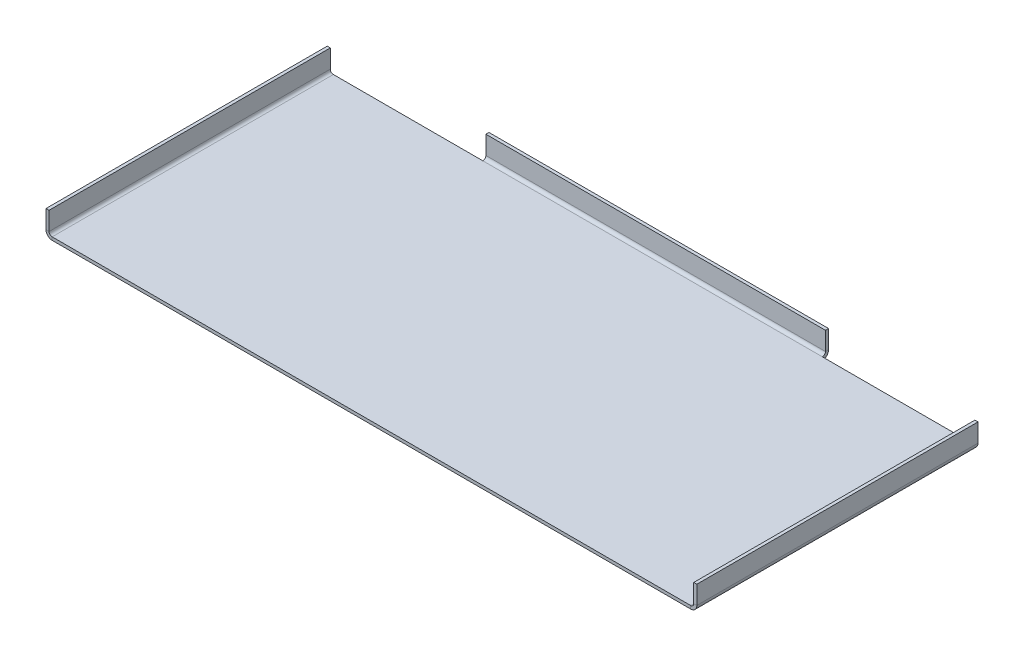
ISO-10303-21;
HEADER;
FILE_DESCRIPTION(('STEP AP214'),'2;1');
FILE_NAME('part.step','',(''),(''),'','','');
FILE_SCHEMA(('AUTOMOTIVE_DESIGN { 1 0 10303 214 1 1 1 1 }'));
ENDSEC;
DATA;
#1=APPLICATION_CONTEXT('core data for automotive mechanical design processes');
#2=APPLICATION_PROTOCOL_DEFINITION('international standard','automotive_design',2000,#1);
#3=PRODUCT_CONTEXT('',#1,'mechanical');
#4=PRODUCT('Part','Part','',(#3));
#5=PRODUCT_RELATED_PRODUCT_CATEGORY('part','',(#4));
#6=PRODUCT_DEFINITION_FORMATION('','',#4);
#7=PRODUCT_DEFINITION_CONTEXT('part definition',#1,'design');
#8=PRODUCT_DEFINITION('design','',#6,#7);
#9=PRODUCT_DEFINITION_SHAPE('','',#8);
#10=(LENGTH_UNIT() NAMED_UNIT(*) SI_UNIT(.MILLI.,.METRE.));
#11=(NAMED_UNIT(*) PLANE_ANGLE_UNIT() SI_UNIT($,.RADIAN.));
#12=(NAMED_UNIT(*) SI_UNIT($,.STERADIAN.) SOLID_ANGLE_UNIT());
#13=UNCERTAINTY_MEASURE_WITH_UNIT(LENGTH_MEASURE(1.E-05),#10,'distance_accuracy_value','');
#14=(GEOMETRIC_REPRESENTATION_CONTEXT(3) GLOBAL_UNCERTAINTY_ASSIGNED_CONTEXT((#13)) GLOBAL_UNIT_ASSIGNED_CONTEXT((#10,
#11,#12)) REPRESENTATION_CONTEXT('',''));
#15=CARTESIAN_POINT('',(0.,0.,0.));
#16=DIRECTION('',(0.,0.,1.));
#17=DIRECTION('',(1.,0.,0.));
#18=AXIS2_PLACEMENT_3D('',#15,#16,#17);
#19=CARTESIAN_POINT('',(0.,-3.175,0.));
#20=DIRECTION('',(0.,-1.,0.));
#21=DIRECTION('',(0.,0.,-1.));
#22=AXIS2_PLACEMENT_3D('',#19,#20,#21);
#23=PLANE('',#22);
#24=DIRECTION('',(1.,0.,0.));
#25=VECTOR('',#24,1.);
#26=CARTESIAN_POINT('',(0.,-3.175,0.));
#27=LINE('',#26,#25);
#28=CARTESIAN_POINT('',(6.34999999999997,-3.17499999999998,0.));
#29=VERTEX_POINT('',#28);
#30=CARTESIAN_POINT('',(666.76016,-3.175,0.));
#31=VERTEX_POINT('',#30);
#32=EDGE_CURVE('E390',#29,#31,#27,.T.);
#33=ORIENTED_EDGE('',*,*,#32,.F.);
#34=DIRECTION('',(0.,0.,1.));
#35=VECTOR('',#34,1.);
#36=CARTESIAN_POINT('',(6.34999999999997,-3.17499999999998,0.));
#37=LINE('',#36,#35);
#38=CARTESIAN_POINT('',(6.34999999999995,-3.175,-290.83));
#39=VERTEX_POINT('',#38);
#40=EDGE_CURVE('E230',#29,#39,#37,.F.);
#41=ORIENTED_EDGE('',*,*,#40,.T.);
#42=DIRECTION('',(-1.,0.,0.));
#43=VECTOR('',#42,1.);
#44=CARTESIAN_POINT('',(0.,-3.175,-290.83));
#45=LINE('',#44,#43);
#46=CARTESIAN_POINT('',(160.930679916,-3.175,-290.83));
#47=VERTEX_POINT('',#46);
#48=EDGE_CURVE('E107',#47,#39,#45,.T.);
#49=ORIENTED_EDGE('',*,*,#48,.F.);
#50=DIRECTION('',(-1.,0.,0.));
#51=VECTOR('',#50,1.);
#52=CARTESIAN_POINT('',(160.930679916,-3.17500000000002,-290.83));
#53=LINE('',#52,#51);
#54=CARTESIAN_POINT('',(512.179480084,-3.17500000000002,-290.83));
#55=VERTEX_POINT('',#54);
#56=EDGE_CURVE('E368',#47,#55,#53,.F.);
#57=ORIENTED_EDGE('',*,*,#56,.T.);
#58=CARTESIAN_POINT('',(666.76016,-3.17499999999998,-290.83));
#59=VERTEX_POINT('',#58);
#60=EDGE_CURVE('E13',#59,#55,#45,.T.);
#61=ORIENTED_EDGE('',*,*,#60,.F.);
#62=DIRECTION('',(0.,0.,-1.));
#63=VECTOR('',#62,1.);
#64=CARTESIAN_POINT('',(666.76016,-3.17499999999998,-290.83));
#65=LINE('',#64,#63);
#66=EDGE_CURVE('E318',#59,#31,#65,.F.);
#67=ORIENTED_EDGE('',*,*,#66,.T.);
#68=EDGE_LOOP('',(#33,#41,#49,#57,#61,#67));
#69=FACE_BOUND('',#68,.T.);
#70=ADVANCED_FACE('F98',(#69),#23,.T.);
#71=CARTESIAN_POINT('',(0.,0.,0.));
#72=DIRECTION('',(0.,-1.,0.));
#73=DIRECTION('',(0.,0.,-1.));
#74=AXIS2_PLACEMENT_3D('',#71,#72,#73);
#75=PLANE('',#74);
#76=DIRECTION('',(0.,0.,1.));
#77=VECTOR('',#76,1.);
#78=CARTESIAN_POINT('',(6.34999999999999,0.,0.));
#79=LINE('',#78,#77);
#80=CARTESIAN_POINT('',(6.34999999999999,0.,0.));
#81=VERTEX_POINT('',#80);
#82=CARTESIAN_POINT('',(6.34999999999995,0.,-290.83));
#83=VERTEX_POINT('',#82);
#84=EDGE_CURVE('E280',#81,#83,#79,.F.);
#85=ORIENTED_EDGE('',*,*,#84,.F.);
#86=DIRECTION('',(1.,0.,0.));
#87=VECTOR('',#86,1.);
#88=CARTESIAN_POINT('',(0.,0.,0.));
#89=LINE('',#88,#87);
#90=CARTESIAN_POINT('',(666.76016,0.,0.));
#91=VERTEX_POINT('',#90);
#92=EDGE_CURVE('E387',#81,#91,#89,.T.);
#93=ORIENTED_EDGE('',*,*,#92,.T.);
#94=DIRECTION('',(0.,0.,-1.));
#95=VECTOR('',#94,1.);
#96=CARTESIAN_POINT('',(666.76016,0.,-290.83));
#97=LINE('',#96,#95);
#98=CARTESIAN_POINT('',(666.76016,0.,-290.83));
#99=VERTEX_POINT('',#98);
#100=EDGE_CURVE('E329',#99,#91,#97,.F.);
#101=ORIENTED_EDGE('',*,*,#100,.F.);
#102=DIRECTION('',(-1.,0.,0.));
#103=VECTOR('',#102,1.);
#104=CARTESIAN_POINT('',(0.,0.,-290.83));
#105=LINE('',#104,#103);
#106=CARTESIAN_POINT('',(512.179480084,0.,-290.83));
#107=VERTEX_POINT('',#106);
#108=EDGE_CURVE('E102',#99,#107,#105,.T.);
#109=ORIENTED_EDGE('',*,*,#108,.T.);
#110=DIRECTION('',(-1.,0.,0.));
#111=VECTOR('',#110,1.);
#112=CARTESIAN_POINT('',(160.930679916,0.,-290.83));
#113=LINE('',#112,#111);
#114=CARTESIAN_POINT('',(160.930679916,0.,-290.83));
#115=VERTEX_POINT('',#114);
#116=EDGE_CURVE('E379',#115,#107,#113,.F.);
#117=ORIENTED_EDGE('',*,*,#116,.F.);
#118=EDGE_CURVE('E393',#115,#83,#105,.T.);
#119=ORIENTED_EDGE('',*,*,#118,.T.);
#120=EDGE_LOOP('',(#85,#93,#101,#109,#117,#119));
#121=FACE_BOUND('',#120,.T.);
#122=ADVANCED_FACE('F403',(#121),#75,.F.);
#123=CARTESIAN_POINT('',(0.,-3.175,0.));
#124=DIRECTION('',(0.,0.,1.));
#125=DIRECTION('',(1.,0.,0.));
#126=AXIS2_PLACEMENT_3D('',#123,#124,#125);
#127=PLANE('',#126);
#128=ORIENTED_EDGE('',*,*,#92,.F.);
#129=DIRECTION('',(0.,-1.,0.));
#130=VECTOR('',#129,1.);
#131=CARTESIAN_POINT('',(6.34999999999999,0.,0.));
#132=LINE('',#131,#130);
#133=EDGE_CURVE('E276',#81,#29,#132,.T.);
#134=ORIENTED_EDGE('',*,*,#133,.T.);
#135=ORIENTED_EDGE('',*,*,#32,.T.);
#136=DIRECTION('',(0.,-1.,0.));
#137=VECTOR('',#136,1.);
#138=CARTESIAN_POINT('',(666.76016,0.,0.));
#139=LINE('',#138,#137);
#140=EDGE_CURVE('E333',#91,#31,#139,.T.);
#141=ORIENTED_EDGE('',*,*,#140,.F.);
#142=EDGE_LOOP('',(#128,#134,#135,#141));
#143=FACE_BOUND('',#142,.T.);
#144=ADVANCED_FACE('F100',(#143),#127,.T.);
#145=CARTESIAN_POINT('',(0.,-3.175,-290.83));
#146=DIRECTION('',(0.,0.,-1.));
#147=DIRECTION('',(-1.,0.,0.));
#148=AXIS2_PLACEMENT_3D('',#145,#146,#147);
#149=PLANE('',#148);
#150=ORIENTED_EDGE('',*,*,#108,.F.);
#151=DIRECTION('',(0.,-1.,0.));
#152=VECTOR('',#151,1.);
#153=CARTESIAN_POINT('',(666.76016,0.,-290.83));
#154=LINE('',#153,#152);
#155=EDGE_CURVE('E323',#99,#59,#154,.T.);
#156=ORIENTED_EDGE('',*,*,#155,.T.);
#157=ORIENTED_EDGE('',*,*,#60,.T.);
#158=DIRECTION('',(0.,-1.,0.));
#159=VECTOR('',#158,1.);
#160=CARTESIAN_POINT('',(512.179480084,0.,-290.83));
#161=LINE('',#160,#159);
#162=EDGE_CURVE('E384',#107,#55,#161,.T.);
#163=ORIENTED_EDGE('',*,*,#162,.F.);
#164=EDGE_LOOP('',(#150,#156,#157,#163));
#165=FACE_BOUND('',#164,.T.);
#166=ADVANCED_FACE('F414',(#165),#149,.T.);
#167=DIRECTION('',(0.,-1.,0.));
#168=VECTOR('',#167,1.);
#169=CARTESIAN_POINT('',(6.34999999999995,0.,-290.83));
#170=LINE('',#169,#168);
#171=EDGE_CURVE('E283',#83,#39,#170,.T.);
#172=ORIENTED_EDGE('',*,*,#171,.F.);
#173=ORIENTED_EDGE('',*,*,#118,.F.);
#174=DIRECTION('',(0.,-1.,0.));
#175=VECTOR('',#174,1.);
#176=CARTESIAN_POINT('',(160.930679916,0.,-290.83));
#177=LINE('',#176,#175);
#178=EDGE_CURVE('E374',#115,#47,#177,.T.);
#179=ORIENTED_EDGE('',*,*,#178,.T.);
#180=ORIENTED_EDGE('',*,*,#48,.T.);
#181=EDGE_LOOP('',(#172,#173,#179,#180));
#182=FACE_BOUND('',#181,.T.);
#183=ADVANCED_FACE('F424',(#182),#149,.T.);
#184=CARTESIAN_POINT('',(512.179480084,3.17499999999996,-290.83));
#185=DIRECTION('',(1.,0.,0.));
#186=DIRECTION('',(0.,0.,-1.));
#187=AXIS2_PLACEMENT_3D('',#184,#185,#186);
#188=PLANE('',#187);
#189=DIRECTION('',(0.,0.,1.));
#190=VECTOR('',#189,1.);
#191=CARTESIAN_POINT('',(512.179480084,3.175,-297.18));
#192=LINE('',#191,#190);
#193=CARTESIAN_POINT('',(512.179480084,3.17499999999995,-294.005));
#194=VERTEX_POINT('',#193);
#195=CARTESIAN_POINT('',(512.179480084,3.17499999999995,-297.18));
#196=VERTEX_POINT('',#195);
#197=EDGE_CURVE('E335',#194,#196,#192,.F.);
#198=ORIENTED_EDGE('',*,*,#197,.F.);
#199=CARTESIAN_POINT('',(512.179480084,3.17499999999996,-290.83));
#200=DIRECTION('',(-1.,0.,0.));
#201=DIRECTION('',(0.,0.,1.));
#202=AXIS2_PLACEMENT_3D('',#199,#200,#201);
#203=CIRCLE('',#202,3.17499999999998);
#204=EDGE_CURVE('E376',#107,#194,#203,.F.);
#205=ORIENTED_EDGE('',*,*,#204,.F.);
#206=ORIENTED_EDGE('',*,*,#162,.T.);
#207=CARTESIAN_POINT('',(512.179480084,3.17499999999996,-290.83));
#208=DIRECTION('',(-1.,0.,0.));
#209=DIRECTION('',(0.,0.,1.));
#210=AXIS2_PLACEMENT_3D('',#207,#208,#209);
#211=CIRCLE('',#210,6.34999999999998);
#212=EDGE_CURVE('E371',#55,#196,#211,.F.);
#213=ORIENTED_EDGE('',*,*,#212,.T.);
#214=EDGE_LOOP('',(#198,#205,#206,#213));
#215=FACE_BOUND('',#214,.T.);
#216=ADVANCED_FACE('F412',(#215),#188,.T.);
#217=CARTESIAN_POINT('',(160.930679916,3.17499999999996,-290.83));
#218=DIRECTION('',(1.,0.,0.));
#219=DIRECTION('',(0.,0.,-1.));
#220=AXIS2_PLACEMENT_3D('',#217,#218,#219);
#221=PLANE('',#220);
#222=CARTESIAN_POINT('',(160.930679916,3.17499999999996,-290.83));
#223=DIRECTION('',(-1.,0.,0.));
#224=DIRECTION('',(0.,0.,1.));
#225=AXIS2_PLACEMENT_3D('',#222,#223,#224);
#226=CIRCLE('',#225,3.17499999999998);
#227=CARTESIAN_POINT('',(160.930679916,3.17499999999995,-294.005));
#228=VERTEX_POINT('',#227);
#229=EDGE_CURVE('E341',#228,#115,#226,.T.);
#230=ORIENTED_EDGE('',*,*,#229,.F.);
#231=DIRECTION('',(0.,0.,1.));
#232=VECTOR('',#231,1.);
#233=CARTESIAN_POINT('',(160.930679916,3.17499999999998,-294.005));
#234=LINE('',#233,#232);
#235=CARTESIAN_POINT('',(160.930679916,3.17500000000001,-297.18));
#236=VERTEX_POINT('',#235);
#237=EDGE_CURVE('E362',#228,#236,#234,.F.);
#238=ORIENTED_EDGE('',*,*,#237,.T.);
#239=CARTESIAN_POINT('',(160.930679916,3.17499999999996,-290.83));
#240=DIRECTION('',(-1.,0.,0.));
#241=DIRECTION('',(0.,0.,1.));
#242=AXIS2_PLACEMENT_3D('',#239,#240,#241);
#243=CIRCLE('',#242,6.34999999999998);
#244=EDGE_CURVE('E123',#236,#47,#243,.T.);
#245=ORIENTED_EDGE('',*,*,#244,.T.);
#246=ORIENTED_EDGE('',*,*,#178,.F.);
#247=EDGE_LOOP('',(#230,#238,#245,#246));
#248=FACE_BOUND('',#247,.T.);
#249=ADVANCED_FACE('F425',(#248),#221,.F.);
#250=CARTESIAN_POINT('',(160.930679916,3.17499999999996,-290.83));
#251=DIRECTION('',(-1.,0.,0.));
#252=DIRECTION('',(0.,0.,-1.));
#253=AXIS2_PLACEMENT_3D('',#250,#251,#252);
#254=CYLINDRICAL_SURFACE('',#253,6.34999999999998);
#255=ORIENTED_EDGE('',*,*,#56,.F.);
#256=ORIENTED_EDGE('',*,*,#244,.F.);
#257=DIRECTION('',(-1.,0.,0.));
#258=VECTOR('',#257,1.);
#259=CARTESIAN_POINT('',(0.,3.17500000000001,-297.18));
#260=LINE('',#259,#258);
#261=EDGE_CURVE('E359',#196,#236,#260,.T.);
#262=ORIENTED_EDGE('',*,*,#261,.F.);
#263=ORIENTED_EDGE('',*,*,#212,.F.);
#264=EDGE_LOOP('',(#255,#256,#262,#263));
#265=FACE_BOUND('',#264,.T.);
#266=ADVANCED_FACE('F421',(#265),#254,.T.);
#267=CARTESIAN_POINT('',(160.930679916,3.17499999999996,-290.83));
#268=DIRECTION('',(-1.,0.,0.));
#269=DIRECTION('',(0.,0.,-1.));
#270=AXIS2_PLACEMENT_3D('',#267,#268,#269);
#271=CYLINDRICAL_SURFACE('',#270,3.17499999999998);
#272=ORIENTED_EDGE('',*,*,#116,.T.);
#273=ORIENTED_EDGE('',*,*,#204,.T.);
#274=DIRECTION('',(1.,0.,0.));
#275=VECTOR('',#274,1.);
#276=CARTESIAN_POINT('',(512.179480084,3.17499999999998,-294.005));
#277=LINE('',#276,#275);
#278=EDGE_CURVE('E364',#194,#228,#277,.F.);
#279=ORIENTED_EDGE('',*,*,#278,.T.);
#280=ORIENTED_EDGE('',*,*,#229,.T.);
#281=EDGE_LOOP('',(#272,#273,#279,#280));
#282=FACE_BOUND('',#281,.T.);
#283=ADVANCED_FACE('F408',(#282),#271,.F.);
#284=CARTESIAN_POINT('',(512.179480084,22.225,-297.18));
#285=DIRECTION('',(-1.,0.,0.));
#286=DIRECTION('',(0.,0.,1.));
#287=AXIS2_PLACEMENT_3D('',#284,#285,#286);
#288=PLANE('',#287);
#289=ORIENTED_EDGE('',*,*,#197,.T.);
#290=DIRECTION('',(0.,1.,0.));
#291=VECTOR('',#290,1.);
#292=CARTESIAN_POINT('',(512.179480084,-7.37488517934144E-13,-297.18));
#293=LINE('',#292,#291);
#294=CARTESIAN_POINT('',(512.179480084,22.225,-297.18));
#295=VERTEX_POINT('',#294);
#296=EDGE_CURVE('E349',#295,#196,#293,.F.);
#297=ORIENTED_EDGE('',*,*,#296,.F.);
#298=DIRECTION('',(0.,0.,1.));
#299=VECTOR('',#298,1.);
#300=CARTESIAN_POINT('',(512.179480084,22.225,-297.18));
#301=LINE('',#300,#299);
#302=CARTESIAN_POINT('',(512.179480084,22.225,-294.005));
#303=VERTEX_POINT('',#302);
#304=EDGE_CURVE('E342',#295,#303,#301,.T.);
#305=ORIENTED_EDGE('',*,*,#304,.T.);
#306=DIRECTION('',(0.,-1.,0.));
#307=VECTOR('',#306,1.);
#308=CARTESIAN_POINT('',(512.179480084,22.225,-294.005));
#309=LINE('',#308,#307);
#310=EDGE_CURVE('E356',#303,#194,#309,.T.);
#311=ORIENTED_EDGE('',*,*,#310,.T.);
#312=EDGE_LOOP('',(#289,#297,#305,#311));
#313=FACE_BOUND('',#312,.T.);
#314=ADVANCED_FACE('F442',(#313),#288,.F.);
#315=CARTESIAN_POINT('',(160.930679916,22.225,-297.18));
#316=DIRECTION('',(1.,0.,0.));
#317=DIRECTION('',(0.,0.,-1.));
#318=AXIS2_PLACEMENT_3D('',#315,#316,#317);
#319=PLANE('',#318);
#320=ORIENTED_EDGE('',*,*,#237,.F.);
#321=DIRECTION('',(0.,1.,0.));
#322=VECTOR('',#321,1.);
#323=CARTESIAN_POINT('',(160.930679916,22.225,-294.005));
#324=LINE('',#323,#322);
#325=CARTESIAN_POINT('',(160.930679916,22.225,-294.005));
#326=VERTEX_POINT('',#325);
#327=EDGE_CURVE('E354',#228,#326,#324,.T.);
#328=ORIENTED_EDGE('',*,*,#327,.T.);
#329=DIRECTION('',(0.,0.,1.));
#330=VECTOR('',#329,1.);
#331=CARTESIAN_POINT('',(160.930679916,22.225,-297.18));
#332=LINE('',#331,#330);
#333=CARTESIAN_POINT('',(160.930679916,22.225,-297.18));
#334=VERTEX_POINT('',#333);
#335=EDGE_CURVE('E338',#334,#326,#332,.T.);
#336=ORIENTED_EDGE('',*,*,#335,.F.);
#337=DIRECTION('',(0.,-1.,0.));
#338=VECTOR('',#337,1.);
#339=CARTESIAN_POINT('',(160.930679916,-7.37488517934144E-13,-297.18));
#340=LINE('',#339,#338);
#341=EDGE_CURVE('E347',#236,#334,#340,.F.);
#342=ORIENTED_EDGE('',*,*,#341,.F.);
#343=EDGE_LOOP('',(#320,#328,#336,#342));
#344=FACE_BOUND('',#343,.T.);
#345=ADVANCED_FACE('F435',(#344),#319,.F.);
#346=CARTESIAN_POINT('',(0.,-7.37488517934144E-13,-297.18));
#347=DIRECTION('',(0.,0.,-1.));
#348=DIRECTION('',(0.,1.,0.));
#349=AXIS2_PLACEMENT_3D('',#346,#347,#348);
#350=PLANE('',#349);
#351=ORIENTED_EDGE('',*,*,#296,.T.);
#352=ORIENTED_EDGE('',*,*,#261,.T.);
#353=ORIENTED_EDGE('',*,*,#341,.T.);
#354=DIRECTION('',(-1.,0.,0.));
#355=VECTOR('',#354,1.);
#356=CARTESIAN_POINT('',(0.,22.225,-297.18));
#357=LINE('',#356,#355);
#358=EDGE_CURVE('E345',#334,#295,#357,.F.);
#359=ORIENTED_EDGE('',*,*,#358,.T.);
#360=EDGE_LOOP('',(#351,#352,#353,#359));
#361=FACE_BOUND('',#360,.T.);
#362=ADVANCED_FACE('F438',(#361),#350,.T.);
#363=CARTESIAN_POINT('',(0.,-7.26403064683317E-13,-294.005));
#364=DIRECTION('',(0.,0.,-1.));
#365=DIRECTION('',(0.,1.,0.));
#366=AXIS2_PLACEMENT_3D('',#363,#364,#365);
#367=PLANE('',#366);
#368=ORIENTED_EDGE('',*,*,#278,.F.);
#369=ORIENTED_EDGE('',*,*,#310,.F.);
#370=DIRECTION('',(1.,0.,0.));
#371=VECTOR('',#370,1.);
#372=CARTESIAN_POINT('',(512.179480084,22.225,-294.005));
#373=LINE('',#372,#371);
#374=EDGE_CURVE('E352',#326,#303,#373,.T.);
#375=ORIENTED_EDGE('',*,*,#374,.F.);
#376=ORIENTED_EDGE('',*,*,#327,.F.);
#377=EDGE_LOOP('',(#368,#369,#375,#376));
#378=FACE_BOUND('',#377,.T.);
#379=ADVANCED_FACE('F430',(#378),#367,.F.);
#380=CARTESIAN_POINT('',(512.179480084,22.225,-297.18));
#381=DIRECTION('',(0.,-1.,0.));
#382=DIRECTION('',(0.,0.,-1.));
#383=AXIS2_PLACEMENT_3D('',#380,#381,#382);
#384=PLANE('',#383);
#385=ORIENTED_EDGE('',*,*,#374,.T.);
#386=ORIENTED_EDGE('',*,*,#304,.F.);
#387=ORIENTED_EDGE('',*,*,#358,.F.);
#388=ORIENTED_EDGE('',*,*,#335,.T.);
#389=EDGE_LOOP('',(#385,#386,#387,#388));
#390=FACE_BOUND('',#389,.T.);
#391=ADVANCED_FACE('F444',(#390),#384,.F.);
#392=CARTESIAN_POINT('',(666.76016,3.17500000000005,0.));
#393=DIRECTION('',(0.,0.,1.));
#394=DIRECTION('',(1.,0.,0.));
#395=AXIS2_PLACEMENT_3D('',#392,#393,#394);
#396=PLANE('',#395);
#397=DIRECTION('',(-1.,0.,0.));
#398=VECTOR('',#397,1.);
#399=CARTESIAN_POINT('',(673.11016,3.17500000000002,0.));
#400=LINE('',#399,#398);
#401=CARTESIAN_POINT('',(669.93516,3.17500000000004,0.));
#402=VERTEX_POINT('',#401);
#403=CARTESIAN_POINT('',(673.11016,3.17500000000002,0.));
#404=VERTEX_POINT('',#403);
#405=EDGE_CURVE('E286',#402,#404,#400,.F.);
#406=ORIENTED_EDGE('',*,*,#405,.F.);
#407=CARTESIAN_POINT('',(666.76016,3.17500000000005,0.));
#408=DIRECTION('',(0.,0.,-1.));
#409=DIRECTION('',(-1.,0.,0.));
#410=AXIS2_PLACEMENT_3D('',#407,#408,#409);
#411=CIRCLE('',#410,3.17500000000004);
#412=EDGE_CURVE('E326',#91,#402,#411,.F.);
#413=ORIENTED_EDGE('',*,*,#412,.F.);
#414=ORIENTED_EDGE('',*,*,#140,.T.);
#415=CARTESIAN_POINT('',(666.76016,3.17500000000005,0.));
#416=DIRECTION('',(0.,0.,-1.));
#417=DIRECTION('',(-1.,0.,0.));
#418=AXIS2_PLACEMENT_3D('',#415,#416,#417);
#419=CIRCLE('',#418,6.35000000000004);
#420=EDGE_CURVE('E115',#31,#404,#419,.F.);
#421=ORIENTED_EDGE('',*,*,#420,.T.);
#422=EDGE_LOOP('',(#406,#413,#414,#421));
#423=FACE_BOUND('',#422,.T.);
#424=ADVANCED_FACE('F446',(#423),#396,.T.);
#425=CARTESIAN_POINT('',(666.76016,3.17500000000005,-290.83));
#426=DIRECTION('',(0.,0.,1.));
#427=DIRECTION('',(1.,0.,0.));
#428=AXIS2_PLACEMENT_3D('',#425,#426,#427);
#429=PLANE('',#428);
#430=CARTESIAN_POINT('',(666.76016,3.17500000000005,-290.83));
#431=DIRECTION('',(0.,0.,-1.));
#432=DIRECTION('',(-1.,0.,0.));
#433=AXIS2_PLACEMENT_3D('',#430,#431,#432);
#434=CIRCLE('',#433,3.17500000000004);
#435=CARTESIAN_POINT('',(669.93516,3.17500000000004,-290.83));
#436=VERTEX_POINT('',#435);
#437=EDGE_CURVE('E291',#436,#99,#434,.T.);
#438=ORIENTED_EDGE('',*,*,#437,.F.);
#439=DIRECTION('',(-1.,0.,0.));
#440=VECTOR('',#439,1.);
#441=CARTESIAN_POINT('',(669.93516,3.17500000000004,-290.83));
#442=LINE('',#441,#440);
#443=CARTESIAN_POINT('',(673.11016,3.17500000000002,-290.83));
#444=VERTEX_POINT('',#443);
#445=EDGE_CURVE('E311',#436,#444,#442,.F.);
#446=ORIENTED_EDGE('',*,*,#445,.T.);
#447=CARTESIAN_POINT('',(666.76016,3.17500000000005,-290.83));
#448=DIRECTION('',(0.,0.,-1.));
#449=DIRECTION('',(-1.,0.,0.));
#450=AXIS2_PLACEMENT_3D('',#447,#448,#449);
#451=CIRCLE('',#450,6.35000000000004);
#452=EDGE_CURVE('E321',#444,#59,#451,.T.);
#453=ORIENTED_EDGE('',*,*,#452,.T.);
#454=ORIENTED_EDGE('',*,*,#155,.F.);
#455=EDGE_LOOP('',(#438,#446,#453,#454));
#456=FACE_BOUND('',#455,.T.);
#457=ADVANCED_FACE('F452',(#456),#429,.F.);
#458=CARTESIAN_POINT('',(666.76016,3.17500000000005,-290.83));
#459=DIRECTION('',(0.,0.,-1.));
#460=DIRECTION('',(1.,0.,0.));
#461=AXIS2_PLACEMENT_3D('',#458,#459,#460);
#462=CYLINDRICAL_SURFACE('',#461,6.35000000000004);
#463=ORIENTED_EDGE('',*,*,#66,.F.);
#464=ORIENTED_EDGE('',*,*,#452,.F.);
#465=DIRECTION('',(0.,0.,-1.));
#466=VECTOR('',#465,1.);
#467=CARTESIAN_POINT('',(673.11016,3.17500000000002,0.));
#468=LINE('',#467,#466);
#469=EDGE_CURVE('E309',#444,#404,#468,.F.);
#470=ORIENTED_EDGE('',*,*,#469,.T.);
#471=ORIENTED_EDGE('',*,*,#420,.F.);
#472=EDGE_LOOP('',(#463,#464,#470,#471));
#473=FACE_BOUND('',#472,.T.);
#474=ADVANCED_FACE('F499',(#473),#462,.T.);
#475=CARTESIAN_POINT('',(666.76016,3.17500000000005,-290.83));
#476=DIRECTION('',(0.,0.,-1.));
#477=DIRECTION('',(1.,0.,0.));
#478=AXIS2_PLACEMENT_3D('',#475,#476,#477);
#479=CYLINDRICAL_SURFACE('',#478,3.17500000000004);
#480=ORIENTED_EDGE('',*,*,#100,.T.);
#481=ORIENTED_EDGE('',*,*,#412,.T.);
#482=DIRECTION('',(0.,0.,-1.));
#483=VECTOR('',#482,1.);
#484=CARTESIAN_POINT('',(669.93516,3.17500000000004,0.));
#485=LINE('',#484,#483);
#486=EDGE_CURVE('E314',#402,#436,#485,.T.);
#487=ORIENTED_EDGE('',*,*,#486,.T.);
#488=ORIENTED_EDGE('',*,*,#437,.T.);
#489=EDGE_LOOP('',(#480,#481,#487,#488));
#490=FACE_BOUND('',#489,.T.);
#491=ADVANCED_FACE('F476',(#490),#479,.F.);
#492=CARTESIAN_POINT('',(673.11016,22.225,-290.83));
#493=DIRECTION('',(0.,0.,1.));
#494=DIRECTION('',(1.,0.,0.));
#495=AXIS2_PLACEMENT_3D('',#492,#493,#494);
#496=PLANE('',#495);
#497=ORIENTED_EDGE('',*,*,#445,.F.);
#498=DIRECTION('',(0.,-1.,0.));
#499=VECTOR('',#498,1.);
#500=CARTESIAN_POINT('',(669.93516,22.225,-290.83));
#501=LINE('',#500,#499);
#502=CARTESIAN_POINT('',(669.93516,22.225,-290.83));
#503=VERTEX_POINT('',#502);
#504=EDGE_CURVE('E307',#436,#503,#501,.F.);
#505=ORIENTED_EDGE('',*,*,#504,.T.);
#506=DIRECTION('',(-1.,0.,0.));
#507=VECTOR('',#506,1.);
#508=CARTESIAN_POINT('',(673.11016,22.225,-290.83));
#509=LINE('',#508,#507);
#510=CARTESIAN_POINT('',(673.11016,22.225,-290.83));
#511=VERTEX_POINT('',#510);
#512=EDGE_CURVE('E288',#511,#503,#509,.T.);
#513=ORIENTED_EDGE('',*,*,#512,.F.);
#514=DIRECTION('',(0.,1.,0.));
#515=VECTOR('',#514,1.);
#516=CARTESIAN_POINT('',(673.11016,-3.37352593802528E-12,-290.83));
#517=LINE('',#516,#515);
#518=EDGE_CURVE('E300',#444,#511,#517,.T.);
#519=ORIENTED_EDGE('',*,*,#518,.F.);
#520=EDGE_LOOP('',(#497,#505,#513,#519));
#521=FACE_BOUND('',#520,.T.);
#522=ADVANCED_FACE('F494',(#521),#496,.F.);
#523=CARTESIAN_POINT('',(673.11016,0.,0.));
#524=DIRECTION('',(0.,0.,-1.));
#525=DIRECTION('',(-1.,0.,0.));
#526=AXIS2_PLACEMENT_3D('',#523,#524,#525);
#527=PLANE('',#526);
#528=ORIENTED_EDGE('',*,*,#405,.T.);
#529=DIRECTION('',(0.,-1.,0.));
#530=VECTOR('',#529,1.);
#531=CARTESIAN_POINT('',(673.11016,-3.37352593802528E-12,0.));
#532=LINE('',#531,#530);
#533=CARTESIAN_POINT('',(673.11016,22.225,0.));
#534=VERTEX_POINT('',#533);
#535=EDGE_CURVE('E295',#534,#404,#532,.T.);
#536=ORIENTED_EDGE('',*,*,#535,.F.);
#537=DIRECTION('',(-1.,0.,0.));
#538=VECTOR('',#537,1.);
#539=CARTESIAN_POINT('',(673.11016,22.225,0.));
#540=LINE('',#539,#538);
#541=CARTESIAN_POINT('',(669.93516,22.225,0.));
#542=VERTEX_POINT('',#541);
#543=EDGE_CURVE('E292',#534,#542,#540,.T.);
#544=ORIENTED_EDGE('',*,*,#543,.T.);
#545=DIRECTION('',(0.,1.,0.));
#546=VECTOR('',#545,1.);
#547=CARTESIAN_POINT('',(669.93516,0.,0.));
#548=LINE('',#547,#546);
#549=EDGE_CURVE('E302',#542,#402,#548,.F.);
#550=ORIENTED_EDGE('',*,*,#549,.T.);
#551=EDGE_LOOP('',(#528,#536,#544,#550));
#552=FACE_BOUND('',#551,.T.);
#553=ADVANCED_FACE('F484',(#552),#527,.F.);
#554=CARTESIAN_POINT('',(673.11016,-3.37352593802528E-12,0.));
#555=DIRECTION('',(-1.,0.,0.));
#556=DIRECTION('',(0.,-1.,0.));
#557=AXIS2_PLACEMENT_3D('',#554,#555,#556);
#558=PLANE('',#557);
#559=ORIENTED_EDGE('',*,*,#469,.F.);
#560=ORIENTED_EDGE('',*,*,#518,.T.);
#561=DIRECTION('',(0.,0.,1.));
#562=VECTOR('',#561,1.);
#563=CARTESIAN_POINT('',(673.11016,22.225,0.));
#564=LINE('',#563,#562);
#565=EDGE_CURVE('E298',#511,#534,#564,.T.);
#566=ORIENTED_EDGE('',*,*,#565,.T.);
#567=ORIENTED_EDGE('',*,*,#535,.T.);
#568=EDGE_LOOP('',(#559,#560,#566,#567));
#569=FACE_BOUND('',#568,.T.);
#570=ADVANCED_FACE('F498',(#569),#558,.F.);
#571=CARTESIAN_POINT('',(669.93516,-3.36244048477446E-12,0.));
#572=DIRECTION('',(-1.,0.,0.));
#573=DIRECTION('',(0.,-1.,0.));
#574=AXIS2_PLACEMENT_3D('',#571,#572,#573);
#575=PLANE('',#574);
#576=ORIENTED_EDGE('',*,*,#504,.F.);
#577=ORIENTED_EDGE('',*,*,#486,.F.);
#578=ORIENTED_EDGE('',*,*,#549,.F.);
#579=DIRECTION('',(0.,0.,-1.));
#580=VECTOR('',#579,1.);
#581=CARTESIAN_POINT('',(669.93516,22.225,0.));
#582=LINE('',#581,#580);
#583=EDGE_CURVE('E305',#503,#542,#582,.F.);
#584=ORIENTED_EDGE('',*,*,#583,.F.);
#585=EDGE_LOOP('',(#576,#577,#578,#584));
#586=FACE_BOUND('',#585,.T.);
#587=ADVANCED_FACE('F481',(#586),#575,.T.);
#588=CARTESIAN_POINT('',(673.11016,22.225,0.));
#589=DIRECTION('',(0.,-1.,0.));
#590=DIRECTION('',(1.,0.,0.));
#591=AXIS2_PLACEMENT_3D('',#588,#589,#590);
#592=PLANE('',#591);
#593=ORIENTED_EDGE('',*,*,#583,.T.);
#594=ORIENTED_EDGE('',*,*,#543,.F.);
#595=ORIENTED_EDGE('',*,*,#565,.F.);
#596=ORIENTED_EDGE('',*,*,#512,.T.);
#597=EDGE_LOOP('',(#593,#594,#595,#596));
#598=FACE_BOUND('',#597,.T.);
#599=ADVANCED_FACE('F489',(#598),#592,.F.);
#600=CARTESIAN_POINT('',(6.34999999999997,3.175,-290.83));
#601=DIRECTION('',(0.,0.,-1.));
#602=DIRECTION('',(-1.,0.,0.));
#603=AXIS2_PLACEMENT_3D('',#600,#601,#602);
#604=PLANE('',#603);
#605=DIRECTION('',(1.,0.,0.));
#606=VECTOR('',#605,1.);
#607=CARTESIAN_POINT('',(0.,3.17499999999998,-290.83));
#608=LINE('',#607,#606);
#609=CARTESIAN_POINT('',(3.17499999999999,3.17499999999999,-290.83));
#610=VERTEX_POINT('',#609);
#611=CARTESIAN_POINT('',(0.,3.17499999999998,-290.83));
#612=VERTEX_POINT('',#611);
#613=EDGE_CURVE('E271',#610,#612,#608,.F.);
#614=ORIENTED_EDGE('',*,*,#613,.F.);
#615=CARTESIAN_POINT('',(6.34999999999997,3.175,-290.83));
#616=DIRECTION('',(0.,0.,1.));
#617=DIRECTION('',(1.,0.,0.));
#618=AXIS2_PLACEMENT_3D('',#615,#616,#617);
#619=CIRCLE('',#618,3.17499999999998);
#620=EDGE_CURVE('E233',#83,#610,#619,.F.);
#621=ORIENTED_EDGE('',*,*,#620,.F.);
#622=ORIENTED_EDGE('',*,*,#171,.T.);
#623=CARTESIAN_POINT('',(6.34999999999997,3.175,-290.83));
#624=DIRECTION('',(0.,0.,1.));
#625=DIRECTION('',(1.,0.,0.));
#626=AXIS2_PLACEMENT_3D('',#623,#624,#625);
#627=CIRCLE('',#626,6.34999999999998);
#628=EDGE_CURVE('E275',#39,#612,#627,.F.);
#629=ORIENTED_EDGE('',*,*,#628,.T.);
#630=EDGE_LOOP('',(#614,#621,#622,#629));
#631=FACE_BOUND('',#630,.T.);
#632=ADVANCED_FACE('F661',(#631),#604,.T.);
#633=CARTESIAN_POINT('',(6.35000000000001,3.175,0.));
#634=DIRECTION('',(0.,0.,-1.));
#635=DIRECTION('',(-1.,0.,0.));
#636=AXIS2_PLACEMENT_3D('',#633,#634,#635);
#637=PLANE('',#636);
#638=CARTESIAN_POINT('',(6.35000000000001,3.175,0.));
#639=DIRECTION('',(0.,0.,1.));
#640=DIRECTION('',(1.,0.,0.));
#641=AXIS2_PLACEMENT_3D('',#638,#639,#640);
#642=CIRCLE('',#641,3.17499999999998);
#643=CARTESIAN_POINT('',(3.17500000000003,3.17499999999999,0.));
#644=VERTEX_POINT('',#643);
#645=EDGE_CURVE('E240',#644,#81,#642,.T.);
#646=ORIENTED_EDGE('',*,*,#645,.F.);
#647=DIRECTION('',(1.,0.,0.));
#648=VECTOR('',#647,1.);
#649=CARTESIAN_POINT('',(3.17499999999999,3.17499999999999,0.));
#650=LINE('',#649,#648);
#651=CARTESIAN_POINT('',(0.,3.17499999999998,0.));
#652=VERTEX_POINT('',#651);
#653=EDGE_CURVE('E237',#644,#652,#650,.F.);
#654=ORIENTED_EDGE('',*,*,#653,.T.);
#655=CARTESIAN_POINT('',(6.35000000000001,3.175,0.));
#656=DIRECTION('',(0.,0.,1.));
#657=DIRECTION('',(1.,0.,0.));
#658=AXIS2_PLACEMENT_3D('',#655,#656,#657);
#659=CIRCLE('',#658,6.34999999999998);
#660=EDGE_CURVE('E223',#652,#29,#659,.T.);
#661=ORIENTED_EDGE('',*,*,#660,.T.);
#662=ORIENTED_EDGE('',*,*,#133,.F.);
#663=EDGE_LOOP('',(#646,#654,#661,#662));
#664=FACE_BOUND('',#663,.T.);
#665=ADVANCED_FACE('F238',(#664),#637,.F.);
#666=CARTESIAN_POINT('',(6.35000000000001,3.175,0.));
#667=DIRECTION('',(0.,0.,1.));
#668=DIRECTION('',(-1.,0.,0.));
#669=AXIS2_PLACEMENT_3D('',#666,#667,#668);
#670=CYLINDRICAL_SURFACE('',#669,6.34999999999998);
#671=ORIENTED_EDGE('',*,*,#40,.F.);
#672=ORIENTED_EDGE('',*,*,#660,.F.);
#673=DIRECTION('',(0.,0.,1.));
#674=VECTOR('',#673,1.);
#675=CARTESIAN_POINT('',(0.,3.17499999999998,0.));
#676=LINE('',#675,#674);
#677=EDGE_CURVE('E227',#612,#652,#676,.T.);
#678=ORIENTED_EDGE('',*,*,#677,.F.);
#679=ORIENTED_EDGE('',*,*,#628,.F.);
#680=EDGE_LOOP('',(#671,#672,#678,#679));
#681=FACE_BOUND('',#680,.T.);
#682=ADVANCED_FACE('F225',(#681),#670,.T.);
#683=CARTESIAN_POINT('',(6.35000000000001,3.175,0.));
#684=DIRECTION('',(0.,0.,1.));
#685=DIRECTION('',(-1.,0.,0.));
#686=AXIS2_PLACEMENT_3D('',#683,#684,#685);
#687=CYLINDRICAL_SURFACE('',#686,3.17499999999998);
#688=ORIENTED_EDGE('',*,*,#84,.T.);
#689=ORIENTED_EDGE('',*,*,#620,.T.);
#690=DIRECTION('',(0.,0.,-1.));
#691=VECTOR('',#690,1.);
#692=CARTESIAN_POINT('',(3.17499999999999,3.17499999999999,-290.83));
#693=LINE('',#692,#691);
#694=EDGE_CURVE('E244',#610,#644,#693,.F.);
#695=ORIENTED_EDGE('',*,*,#694,.T.);
#696=ORIENTED_EDGE('',*,*,#645,.T.);
#697=EDGE_LOOP('',(#688,#689,#695,#696));
#698=FACE_BOUND('',#697,.T.);
#699=ADVANCED_FACE('F689',(#698),#687,.F.);
#700=CARTESIAN_POINT('',(0.,0.,0.));
#701=DIRECTION('',(0.,0.,-1.));
#702=DIRECTION('',(0.,1.,0.));
#703=AXIS2_PLACEMENT_3D('',#700,#701,#702);
#704=PLANE('',#703);
#705=ORIENTED_EDGE('',*,*,#653,.F.);
#706=DIRECTION('',(0.,1.,0.));
#707=VECTOR('',#706,1.);
#708=CARTESIAN_POINT('',(3.175,0.,0.));
#709=LINE('',#708,#707);
#710=CARTESIAN_POINT('',(3.17499999999992,22.225,0.));
#711=VERTEX_POINT('',#710);
#712=EDGE_CURVE('E253',#644,#711,#709,.T.);
#713=ORIENTED_EDGE('',*,*,#712,.T.);
#714=DIRECTION('',(1.,0.,0.));
#715=VECTOR('',#714,1.);
#716=CARTESIAN_POINT('',(0.,22.225,0.));
#717=LINE('',#716,#715);
#718=CARTESIAN_POINT('',(0.,22.225,0.));
#719=VERTEX_POINT('',#718);
#720=EDGE_CURVE('E257',#719,#711,#717,.T.);
#721=ORIENTED_EDGE('',*,*,#720,.F.);
#722=DIRECTION('',(0.,-1.,0.));
#723=VECTOR('',#722,1.);
#724=CARTESIAN_POINT('',(0.,0.,0.));
#725=LINE('',#724,#723);
#726=EDGE_CURVE('E249',#652,#719,#725,.F.);
#727=ORIENTED_EDGE('',*,*,#726,.F.);
#728=EDGE_LOOP('',(#705,#713,#721,#727));
#729=FACE_BOUND('',#728,.T.);
#730=ADVANCED_FACE('F255',(#729),#704,.F.);
#731=CARTESIAN_POINT('',(0.,22.225,-290.83));
#732=DIRECTION('',(0.,0.,1.));
#733=DIRECTION('',(1.,0.,0.));
#734=AXIS2_PLACEMENT_3D('',#731,#732,#733);
#735=PLANE('',#734);
#736=ORIENTED_EDGE('',*,*,#613,.T.);
#737=DIRECTION('',(0.,1.,0.));
#738=VECTOR('',#737,1.);
#739=CARTESIAN_POINT('',(0.,0.,-290.83));
#740=LINE('',#739,#738);
#741=CARTESIAN_POINT('',(0.,22.225,-290.83));
#742=VERTEX_POINT('',#741);
#743=EDGE_CURVE('E252',#742,#612,#740,.F.);
#744=ORIENTED_EDGE('',*,*,#743,.F.);
#745=DIRECTION('',(1.,0.,0.));
#746=VECTOR('',#745,1.);
#747=CARTESIAN_POINT('',(0.,22.225,-290.83));
#748=LINE('',#747,#746);
#749=CARTESIAN_POINT('',(3.17499999999992,22.225,-290.83));
#750=VERTEX_POINT('',#749);
#751=EDGE_CURVE('E778',#742,#750,#748,.T.);
#752=ORIENTED_EDGE('',*,*,#751,.T.);
#753=DIRECTION('',(0.,-1.,0.));
#754=VECTOR('',#753,1.);
#755=CARTESIAN_POINT('',(3.17499999999992,22.225,-290.83));
#756=LINE('',#755,#754);
#757=EDGE_CURVE('E260',#750,#610,#756,.T.);
#758=ORIENTED_EDGE('',*,*,#757,.T.);
#759=EDGE_LOOP('',(#736,#744,#752,#758));
#760=FACE_BOUND('',#759,.T.);
#761=ADVANCED_FACE('F709',(#760),#735,.F.);
#762=CARTESIAN_POINT('',(0.,0.,0.));
#763=DIRECTION('',(-1.,0.,0.));
#764=DIRECTION('',(0.,-1.,0.));
#765=AXIS2_PLACEMENT_3D('',#762,#763,#764);
#766=PLANE('',#765);
#767=ORIENTED_EDGE('',*,*,#743,.T.);
#768=ORIENTED_EDGE('',*,*,#677,.T.);
#769=ORIENTED_EDGE('',*,*,#726,.T.);
#770=DIRECTION('',(0.,0.,1.));
#771=VECTOR('',#770,1.);
#772=CARTESIAN_POINT('',(0.,22.225,0.));
#773=LINE('',#772,#771);
#774=EDGE_CURVE('E259',#719,#742,#773,.F.);
#775=ORIENTED_EDGE('',*,*,#774,.T.);
#776=EDGE_LOOP('',(#767,#768,#769,#775));
#777=FACE_BOUND('',#776,.T.);
#778=ADVANCED_FACE('F248',(#777),#766,.T.);
#779=CARTESIAN_POINT('',(3.175,0.,0.));
#780=DIRECTION('',(-1.,0.,0.));
#781=DIRECTION('',(0.,-1.,0.));
#782=AXIS2_PLACEMENT_3D('',#779,#780,#781);
#783=PLANE('',#782);
#784=ORIENTED_EDGE('',*,*,#694,.F.);
#785=ORIENTED_EDGE('',*,*,#757,.F.);
#786=DIRECTION('',(0.,0.,-1.));
#787=VECTOR('',#786,1.);
#788=CARTESIAN_POINT('',(3.17499999999992,22.225,0.));
#789=LINE('',#788,#787);
#790=EDGE_CURVE('E264',#711,#750,#789,.T.);
#791=ORIENTED_EDGE('',*,*,#790,.F.);
#792=ORIENTED_EDGE('',*,*,#712,.F.);
#793=EDGE_LOOP('',(#784,#785,#791,#792));
#794=FACE_BOUND('',#793,.T.);
#795=ADVANCED_FACE('F729',(#794),#783,.F.);
#796=CARTESIAN_POINT('',(0.,22.225,0.));
#797=DIRECTION('',(0.,-1.,0.));
#798=DIRECTION('',(1.,0.,0.));
#799=AXIS2_PLACEMENT_3D('',#796,#797,#798);
#800=PLANE('',#799);
#801=ORIENTED_EDGE('',*,*,#790,.T.);
#802=ORIENTED_EDGE('',*,*,#751,.F.);
#803=ORIENTED_EDGE('',*,*,#774,.F.);
#804=ORIENTED_EDGE('',*,*,#720,.T.);
#805=EDGE_LOOP('',(#801,#802,#803,#804));
#806=FACE_BOUND('',#805,.T.);
#807=ADVANCED_FACE('F739',(#806),#800,.F.);
#808=CLOSED_SHELL('',(#70,#122,#144,#166,#183,#216,#249,#266,#283,#314,#345,#362,#379,#391,#424,
#457,#474,#491,#522,#553,#570,#587,#599,#632,#665,#682,#699,#730,#761,#778,#795,#807));
#809=MANIFOLD_SOLID_BREP('B2',#808);
#810=ADVANCED_BREP_SHAPE_REPRESENTATION('',(#18,#809),#14);
#811=SHAPE_DEFINITION_REPRESENTATION(#9,#810);
ENDSEC;
END-ISO-10303-21;
